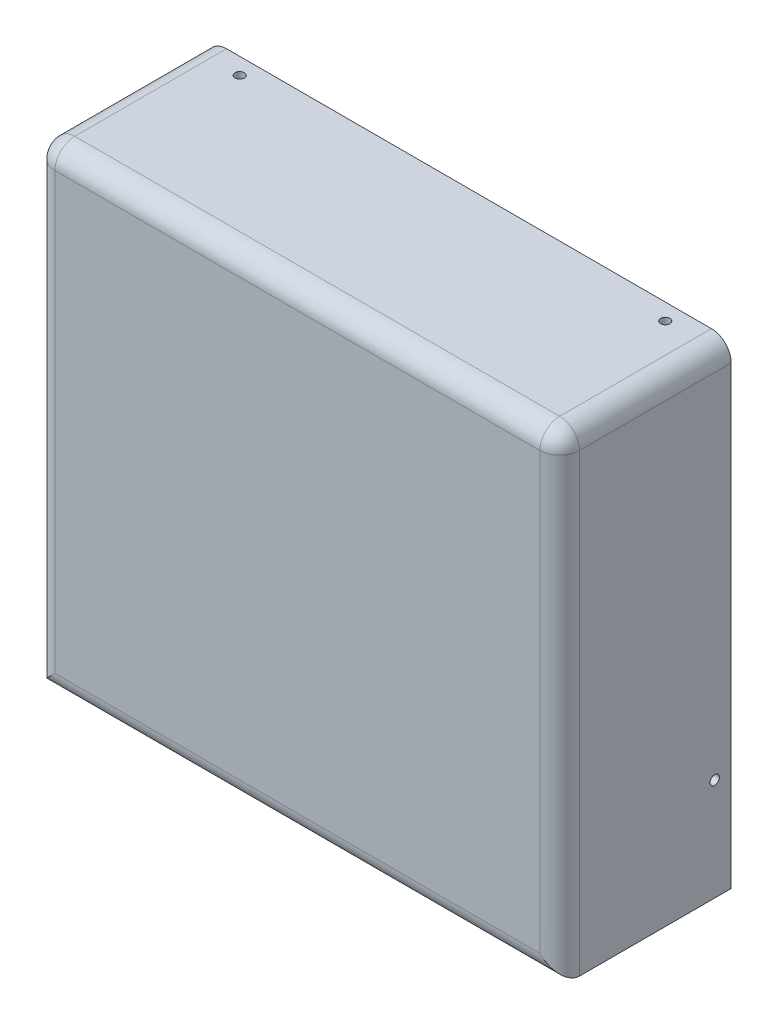
ISO-10303-21;
HEADER;
FILE_DESCRIPTION(('STEP AP214'),'2;1');
FILE_NAME('part.step','',(''),(''),'','','');
FILE_SCHEMA(('AUTOMOTIVE_DESIGN { 1 0 10303 214 1 1 1 1 }'));
ENDSEC;
DATA;
#1=APPLICATION_CONTEXT('core data for automotive mechanical design processes');
#2=APPLICATION_PROTOCOL_DEFINITION('international standard','automotive_design',2000,#1);
#3=PRODUCT_CONTEXT('',#1,'mechanical');
#4=PRODUCT('Part','Part','',(#3));
#5=PRODUCT_RELATED_PRODUCT_CATEGORY('part','',(#4));
#6=PRODUCT_DEFINITION_FORMATION('','',#4);
#7=PRODUCT_DEFINITION_CONTEXT('part definition',#1,'design');
#8=PRODUCT_DEFINITION('design','',#6,#7);
#9=PRODUCT_DEFINITION_SHAPE('','',#8);
#10=(LENGTH_UNIT() NAMED_UNIT(*) SI_UNIT(.MILLI.,.METRE.));
#11=(NAMED_UNIT(*) PLANE_ANGLE_UNIT() SI_UNIT($,.RADIAN.));
#12=(NAMED_UNIT(*) SI_UNIT($,.STERADIAN.) SOLID_ANGLE_UNIT());
#13=UNCERTAINTY_MEASURE_WITH_UNIT(LENGTH_MEASURE(1.E-05),#10,'distance_accuracy_value','');
#14=(GEOMETRIC_REPRESENTATION_CONTEXT(3) GLOBAL_UNCERTAINTY_ASSIGNED_CONTEXT((#13)) GLOBAL_UNIT_ASSIGNED_CONTEXT((#10,
#11,#12)) REPRESENTATION_CONTEXT('',''));
#15=CARTESIAN_POINT('',(0.,0.,0.));
#16=DIRECTION('',(0.,0.,1.));
#17=DIRECTION('',(1.,0.,0.));
#18=AXIS2_PLACEMENT_3D('',#15,#16,#17);
#19=CARTESIAN_POINT('',(0.,0.,63.5));
#20=DIRECTION('',(0.,-1.,0.));
#21=DIRECTION('',(0.,0.,-1.));
#22=AXIS2_PLACEMENT_3D('',#19,#20,#21);
#23=PLANE('',#22);
#24=CARTESIAN_POINT('',(16.51,0.,6.35));
#25=DIRECTION('',(0.,-1.,0.));
#26=DIRECTION('',(0.,0.,-1.));
#27=AXIS2_PLACEMENT_3D('',#24,#25,#26);
#28=CIRCLE('',#27,1.786001);
#29=CARTESIAN_POINT('',(16.51,0.,4.563999));
#30=VERTEX_POINT('',#29);
#31=EDGE_CURVE('E433',#30,#30,#28,.F.);
#32=ORIENTED_EDGE('',*,*,#31,.T.);
#33=EDGE_LOOP('',(#32));
#34=FACE_BOUND('',#33,.T.);
#35=DIRECTION('',(-1.,0.,0.));
#36=VECTOR('',#35,1.);
#37=CARTESIAN_POINT('',(0.,0.,0.));
#38=LINE('',#37,#36);
#39=CARTESIAN_POINT('',(191.77,0.,0.));
#40=VERTEX_POINT('',#39);
#41=CARTESIAN_POINT('',(5.08,0.,0.));
#42=VERTEX_POINT('',#41);
#43=EDGE_CURVE('E384',#40,#42,#38,.T.);
#44=ORIENTED_EDGE('',*,*,#43,.F.);
#45=DIRECTION('',(0.,0.,-1.));
#46=VECTOR('',#45,1.);
#47=CARTESIAN_POINT('',(191.77,0.,63.5));
#48=LINE('',#47,#46);
#49=CARTESIAN_POINT('',(191.77,0.,58.42));
#50=VERTEX_POINT('',#49);
#51=EDGE_CURVE('E361',#50,#40,#48,.T.);
#52=ORIENTED_EDGE('',*,*,#51,.F.);
#53=DIRECTION('',(-1.,0.,0.));
#54=VECTOR('',#53,1.);
#55=CARTESIAN_POINT('',(196.85,0.,58.42));
#56=LINE('',#55,#54);
#57=CARTESIAN_POINT('',(5.08,0.,58.42));
#58=VERTEX_POINT('',#57);
#59=EDGE_CURVE('E357',#58,#50,#56,.F.);
#60=ORIENTED_EDGE('',*,*,#59,.F.);
#61=DIRECTION('',(0.,0.,-1.));
#62=VECTOR('',#61,1.);
#63=CARTESIAN_POINT('',(5.08,0.,63.5));
#64=LINE('',#63,#62);
#65=EDGE_CURVE('E354',#42,#58,#64,.F.);
#66=ORIENTED_EDGE('',*,*,#65,.F.);
#67=EDGE_LOOP('',(#44,#52,#60,#66));
#68=FACE_BOUND('',#67,.T.);
#69=CARTESIAN_POINT('',(180.34,0.,6.35));
#70=DIRECTION('',(0.,-1.,0.));
#71=DIRECTION('',(0.,0.,-1.));
#72=AXIS2_PLACEMENT_3D('',#69,#70,#71);
#73=CIRCLE('',#72,1.78600100000001);
#74=CARTESIAN_POINT('',(180.34,0.,4.56399899999999));
#75=VERTEX_POINT('',#74);
#76=EDGE_CURVE('E416',#75,#75,#73,.F.);
#77=ORIENTED_EDGE('',*,*,#76,.T.);
#78=EDGE_LOOP('',(#77));
#79=FACE_BOUND('',#78,.T.);
#80=ADVANCED_FACE('F39',(#34,#68,#79),#23,.T.);
#81=CARTESIAN_POINT('',(-2.54,0.,63.5));
#82=DIRECTION('',(1.,0.,0.));
#83=DIRECTION('',(0.,1.,0.));
#84=AXIS2_PLACEMENT_3D('',#81,#82,#83);
#85=PLANE('',#84);
#86=CARTESIAN_POINT('',(-2.53999999999998,-140.97,6.35));
#87=DIRECTION('',(-1.,0.,0.));
#88=DIRECTION('',(0.,0.,1.));
#89=AXIS2_PLACEMENT_3D('',#86,#87,#88);
#90=CIRCLE('',#89,1.78600099999998);
#91=CARTESIAN_POINT('',(-2.53999999999998,-140.97,8.13600099999998));
#92=VERTEX_POINT('',#91);
#93=EDGE_CURVE('E449',#92,#92,#90,.T.);
#94=ORIENTED_EDGE('',*,*,#93,.F.);
#95=EDGE_LOOP('',(#94));
#96=FACE_BOUND('',#95,.T.);
#97=DIRECTION('',(0.,0.,-1.));
#98=VECTOR('',#97,1.);
#99=CARTESIAN_POINT('',(-2.53999999999998,-180.34,63.5));
#100=LINE('',#99,#98);
#101=CARTESIAN_POINT('',(-2.53999999999998,-180.34,58.42));
#102=VERTEX_POINT('',#101);
#103=CARTESIAN_POINT('',(-2.53999999999998,-180.34,0.));
#104=VERTEX_POINT('',#103);
#105=EDGE_CURVE('E219',#102,#104,#100,.T.);
#106=ORIENTED_EDGE('',*,*,#105,.F.);
#107=DIRECTION('',(0.,1.,0.));
#108=VECTOR('',#107,1.);
#109=CARTESIAN_POINT('',(-2.54,0.,58.42));
#110=LINE('',#109,#108);
#111=CARTESIAN_POINT('',(-2.54,-5.08,58.42));
#112=VERTEX_POINT('',#111);
#113=EDGE_CURVE('E66',#102,#112,#110,.T.);
#114=ORIENTED_EDGE('',*,*,#113,.T.);
#115=DIRECTION('',(0.,0.,1.));
#116=VECTOR('',#115,1.);
#117=CARTESIAN_POINT('',(-2.54,-5.08,63.5));
#118=LINE('',#117,#116);
#119=CARTESIAN_POINT('',(-2.54,-5.08,0.));
#120=VERTEX_POINT('',#119);
#121=EDGE_CURVE('E299',#112,#120,#118,.F.);
#122=ORIENTED_EDGE('',*,*,#121,.T.);
#123=DIRECTION('',(0.,-1.,0.));
#124=VECTOR('',#123,1.);
#125=CARTESIAN_POINT('',(-2.54,0.,0.));
#126=LINE('',#125,#124);
#127=EDGE_CURVE('E113',#120,#104,#126,.T.);
#128=ORIENTED_EDGE('',*,*,#127,.T.);
#129=EDGE_LOOP('',(#106,#114,#122,#128));
#130=FACE_BOUND('',#129,.T.);
#131=ADVANCED_FACE('F456',(#96,#130),#85,.F.);
#132=CARTESIAN_POINT('',(0.,-180.34,63.5));
#133=DIRECTION('',(0.,1.,0.));
#134=DIRECTION('',(0.,0.,1.));
#135=AXIS2_PLACEMENT_3D('',#132,#133,#134);
#136=PLANE('',#135);
#137=CARTESIAN_POINT('',(191.77,-180.34,11.7475));
#138=DIRECTION('',(0.,-1.,0.));
#139=DIRECTION('',(-1.,0.,0.));
#140=AXIS2_PLACEMENT_3D('',#137,#138,#139);
#141=CIRCLE('',#140,5.08);
#142=CARTESIAN_POINT('',(196.85,-180.34,11.7475));
#143=VERTEX_POINT('',#142);
#144=CARTESIAN_POINT('',(191.77,-180.34,16.8275));
#145=VERTEX_POINT('',#144);
#146=EDGE_CURVE('E415',#143,#145,#141,.T.);
#147=ORIENTED_EDGE('',*,*,#146,.F.);
#148=DIRECTION('',(0.,0.,1.));
#149=VECTOR('',#148,1.);
#150=CARTESIAN_POINT('',(196.85,-180.34,11.7475));
#151=LINE('',#150,#149);
#152=CARTESIAN_POINT('',(196.85,-180.34,0.));
#153=VERTEX_POINT('',#152);
#154=EDGE_CURVE('E412',#153,#143,#151,.T.);
#155=ORIENTED_EDGE('',*,*,#154,.F.);
#156=DIRECTION('',(1.,0.,0.));
#157=VECTOR('',#156,1.);
#158=CARTESIAN_POINT('',(0.,-180.34,0.));
#159=LINE('',#158,#157);
#160=CARTESIAN_POINT('',(199.39,-180.34,0.));
#161=VERTEX_POINT('',#160);
#162=EDGE_CURVE('E222',#153,#161,#159,.T.);
#163=ORIENTED_EDGE('',*,*,#162,.T.);
#164=DIRECTION('',(0.,0.,-1.));
#165=VECTOR('',#164,1.);
#166=CARTESIAN_POINT('',(199.39,-180.34,63.5));
#167=LINE('',#166,#165);
#168=CARTESIAN_POINT('',(199.39,-180.34,58.42));
#169=VERTEX_POINT('',#168);
#170=EDGE_CURVE('E233',#169,#161,#167,.T.);
#171=ORIENTED_EDGE('',*,*,#170,.F.);
#172=DIRECTION('',(1.,0.,0.));
#173=VECTOR('',#172,1.);
#174=CARTESIAN_POINT('',(0.,-180.34,58.42));
#175=LINE('',#174,#173);
#176=EDGE_CURVE('E294',#169,#102,#175,.F.);
#177=ORIENTED_EDGE('',*,*,#176,.T.);
#178=ORIENTED_EDGE('',*,*,#105,.T.);
#179=CARTESIAN_POINT('',(0.,-180.34,0.));
#180=VERTEX_POINT('',#179);
#181=EDGE_CURVE('E198',#104,#180,#159,.T.);
#182=ORIENTED_EDGE('',*,*,#181,.T.);
#183=DIRECTION('',(0.,0.,-1.));
#184=VECTOR('',#183,1.);
#185=CARTESIAN_POINT('',(0.,-180.34,0.));
#186=LINE('',#185,#184);
#187=CARTESIAN_POINT('',(0.,-180.34,11.7475));
#188=VERTEX_POINT('',#187);
#189=EDGE_CURVE('E207',#188,#180,#186,.T.);
#190=ORIENTED_EDGE('',*,*,#189,.F.);
#191=CARTESIAN_POINT('',(5.08,-180.34,11.7475));
#192=DIRECTION('',(0.,-1.,0.));
#193=DIRECTION('',(1.,0.,0.));
#194=AXIS2_PLACEMENT_3D('',#191,#192,#193);
#195=CIRCLE('',#194,5.08);
#196=CARTESIAN_POINT('',(5.08,-180.34,16.8275));
#197=VERTEX_POINT('',#196);
#198=EDGE_CURVE('E215',#197,#188,#195,.T.);
#199=ORIENTED_EDGE('',*,*,#198,.F.);
#200=DIRECTION('',(-1.,0.,0.));
#201=VECTOR('',#200,1.);
#202=CARTESIAN_POINT('',(5.08,-180.34,16.8275));
#203=LINE('',#202,#201);
#204=EDGE_CURVE('E420',#145,#197,#203,.T.);
#205=ORIENTED_EDGE('',*,*,#204,.F.);
#206=EDGE_LOOP('',(#147,#155,#163,#171,#177,#178,#182,#190,#199,#205));
#207=FACE_BOUND('',#206,.T.);
#208=ADVANCED_FACE('F218',(#207),#136,.F.);
#209=CARTESIAN_POINT('',(199.39,0.,63.5));
#210=DIRECTION('',(-1.,0.,0.));
#211=DIRECTION('',(0.,-1.,0.));
#212=AXIS2_PLACEMENT_3D('',#209,#210,#211);
#213=PLANE('',#212);
#214=CARTESIAN_POINT('',(199.39,-140.97,6.35));
#215=DIRECTION('',(-1.,0.,0.));
#216=DIRECTION('',(0.,0.,1.));
#217=AXIS2_PLACEMENT_3D('',#214,#215,#216);
#218=CIRCLE('',#217,1.78600099999995);
#219=CARTESIAN_POINT('',(199.39,-140.97,8.13600099999996));
#220=VERTEX_POINT('',#219);
#221=EDGE_CURVE('E445',#220,#220,#218,.T.);
#222=ORIENTED_EDGE('',*,*,#221,.T.);
#223=EDGE_LOOP('',(#222));
#224=FACE_BOUND('',#223,.T.);
#225=DIRECTION('',(0.,0.,1.));
#226=VECTOR('',#225,1.);
#227=CARTESIAN_POINT('',(199.39,-5.08,63.5));
#228=LINE('',#227,#226);
#229=CARTESIAN_POINT('',(199.39,-5.08,0.));
#230=VERTEX_POINT('',#229);
#231=CARTESIAN_POINT('',(199.39,-5.08,58.42));
#232=VERTEX_POINT('',#231);
#233=EDGE_CURVE('E261',#230,#232,#228,.T.);
#234=ORIENTED_EDGE('',*,*,#233,.T.);
#235=DIRECTION('',(0.,-1.,0.));
#236=VECTOR('',#235,1.);
#237=CARTESIAN_POINT('',(199.39,0.,58.42));
#238=LINE('',#237,#236);
#239=EDGE_CURVE('E291',#232,#169,#238,.T.);
#240=ORIENTED_EDGE('',*,*,#239,.T.);
#241=ORIENTED_EDGE('',*,*,#170,.T.);
#242=DIRECTION('',(0.,1.,0.));
#243=VECTOR('',#242,1.);
#244=CARTESIAN_POINT('',(199.39,0.,0.));
#245=LINE('',#244,#243);
#246=EDGE_CURVE('E221',#161,#230,#245,.T.);
#247=ORIENTED_EDGE('',*,*,#246,.T.);
#248=EDGE_LOOP('',(#234,#240,#241,#247));
#249=FACE_BOUND('',#248,.T.);
#250=ADVANCED_FACE('F493',(#224,#249),#213,.F.);
#251=CARTESIAN_POINT('',(0.,2.54,63.5));
#252=DIRECTION('',(0.,-1.,0.));
#253=DIRECTION('',(0.,0.,-1.));
#254=AXIS2_PLACEMENT_3D('',#251,#252,#253);
#255=PLANE('',#254);
#256=CARTESIAN_POINT('',(16.51,2.54,6.35));
#257=DIRECTION('',(0.,1.,0.));
#258=DIRECTION('',(0.,0.,1.));
#259=AXIS2_PLACEMENT_3D('',#256,#257,#258);
#260=CIRCLE('',#259,1.786001);
#261=CARTESIAN_POINT('',(16.51,2.54,8.136001));
#262=VERTEX_POINT('',#261);
#263=EDGE_CURVE('E437',#262,#262,#260,.T.);
#264=ORIENTED_EDGE('',*,*,#263,.F.);
#265=EDGE_LOOP('',(#264));
#266=FACE_BOUND('',#265,.T.);
#267=CARTESIAN_POINT('',(180.34,2.54,6.35));
#268=DIRECTION('',(0.,1.,0.));
#269=DIRECTION('',(0.,0.,1.));
#270=AXIS2_PLACEMENT_3D('',#267,#268,#269);
#271=CIRCLE('',#270,1.78600100000001);
#272=CARTESIAN_POINT('',(180.34,2.54,8.13600100000001));
#273=VERTEX_POINT('',#272);
#274=EDGE_CURVE('E429',#273,#273,#271,.T.);
#275=ORIENTED_EDGE('',*,*,#274,.F.);
#276=EDGE_LOOP('',(#275));
#277=FACE_BOUND('',#276,.T.);
#278=DIRECTION('',(-1.,0.,0.));
#279=VECTOR('',#278,1.);
#280=CARTESIAN_POINT('',(0.,2.54,0.));
#281=LINE('',#280,#279);
#282=CARTESIAN_POINT('',(191.77,2.54,0.));
#283=VERTEX_POINT('',#282);
#284=CARTESIAN_POINT('',(5.08,2.54,0.));
#285=VERTEX_POINT('',#284);
#286=EDGE_CURVE('E226',#283,#285,#281,.T.);
#287=ORIENTED_EDGE('',*,*,#286,.T.);
#288=DIRECTION('',(0.,0.,-1.));
#289=VECTOR('',#288,1.);
#290=CARTESIAN_POINT('',(5.08,2.54,63.5));
#291=LINE('',#290,#289);
#292=CARTESIAN_POINT('',(5.08,2.54,58.42));
#293=VERTEX_POINT('',#292);
#294=EDGE_CURVE('E257',#285,#293,#291,.F.);
#295=ORIENTED_EDGE('',*,*,#294,.T.);
#296=DIRECTION('',(1.,0.,0.));
#297=VECTOR('',#296,1.);
#298=CARTESIAN_POINT('',(0.,2.54,58.42));
#299=LINE('',#298,#297);
#300=CARTESIAN_POINT('',(191.77,2.54,58.42));
#301=VERTEX_POINT('',#300);
#302=EDGE_CURVE('E253',#293,#301,#299,.T.);
#303=ORIENTED_EDGE('',*,*,#302,.T.);
#304=DIRECTION('',(0.,0.,-1.));
#305=VECTOR('',#304,1.);
#306=CARTESIAN_POINT('',(191.77,2.54,63.5));
#307=LINE('',#306,#305);
#308=EDGE_CURVE('E258',#301,#283,#307,.T.);
#309=ORIENTED_EDGE('',*,*,#308,.T.);
#310=EDGE_LOOP('',(#287,#295,#303,#309));
#311=FACE_BOUND('',#310,.T.);
#312=ADVANCED_FACE('F482',(#266,#277,#311),#255,.F.);
#313=CARTESIAN_POINT('',(0.,0.,66.04));
#314=DIRECTION('',(0.,0.,1.));
#315=DIRECTION('',(1.,0.,0.));
#316=AXIS2_PLACEMENT_3D('',#313,#314,#315);
#317=PLANE('',#316);
#318=DIRECTION('',(0.,1.,0.));
#319=VECTOR('',#318,1.);
#320=CARTESIAN_POINT('',(191.77,0.,66.04));
#321=LINE('',#320,#319);
#322=CARTESIAN_POINT('',(191.77,-172.72,66.04));
#323=VERTEX_POINT('',#322);
#324=CARTESIAN_POINT('',(191.77,-5.08,66.04));
#325=VERTEX_POINT('',#324);
#326=EDGE_CURVE('E280',#323,#325,#321,.T.);
#327=ORIENTED_EDGE('',*,*,#326,.T.);
#328=DIRECTION('',(1.,0.,0.));
#329=VECTOR('',#328,1.);
#330=CARTESIAN_POINT('',(0.,-5.08,66.04));
#331=LINE('',#330,#329);
#332=CARTESIAN_POINT('',(5.08,-5.08,66.04));
#333=VERTEX_POINT('',#332);
#334=EDGE_CURVE('E269',#325,#333,#331,.F.);
#335=ORIENTED_EDGE('',*,*,#334,.T.);
#336=DIRECTION('',(0.,1.,0.));
#337=VECTOR('',#336,1.);
#338=CARTESIAN_POINT('',(5.08,0.,66.04));
#339=LINE('',#338,#337);
#340=CARTESIAN_POINT('',(5.08000000000002,-172.72,66.04));
#341=VERTEX_POINT('',#340);
#342=EDGE_CURVE('E273',#333,#341,#339,.F.);
#343=ORIENTED_EDGE('',*,*,#342,.T.);
#344=DIRECTION('',(1.,0.,0.));
#345=VECTOR('',#344,1.);
#346=CARTESIAN_POINT('',(0.,-172.72,66.04));
#347=LINE('',#346,#345);
#348=EDGE_CURVE('E276',#341,#323,#347,.T.);
#349=ORIENTED_EDGE('',*,*,#348,.T.);
#350=EDGE_LOOP('',(#327,#335,#343,#349));
#351=FACE_BOUND('',#350,.T.);
#352=ADVANCED_FACE('F500',(#351),#317,.T.);
#353=CARTESIAN_POINT('',(0.,0.,0.));
#354=DIRECTION('',(0.,0.,1.));
#355=DIRECTION('',(1.,0.,0.));
#356=AXIS2_PLACEMENT_3D('',#353,#354,#355);
#357=PLANE('',#356);
#358=ORIENTED_EDGE('',*,*,#162,.F.);
#359=DIRECTION('',(0.,1.,0.));
#360=VECTOR('',#359,1.);
#361=CARTESIAN_POINT('',(196.85,0.,0.));
#362=LINE('',#361,#360);
#363=CARTESIAN_POINT('',(196.85,-5.08,0.));
#364=VERTEX_POINT('',#363);
#365=EDGE_CURVE('E203',#153,#364,#362,.T.);
#366=ORIENTED_EDGE('',*,*,#365,.T.);
#367=CARTESIAN_POINT('',(191.77,-5.08,0.));
#368=DIRECTION('',(0.,0.,1.));
#369=DIRECTION('',(1.,0.,0.));
#370=AXIS2_PLACEMENT_3D('',#367,#368,#369);
#371=CIRCLE('',#370,5.08);
#372=EDGE_CURVE('E338',#40,#364,#371,.F.);
#373=ORIENTED_EDGE('',*,*,#372,.F.);
#374=ORIENTED_EDGE('',*,*,#43,.T.);
#375=CARTESIAN_POINT('',(5.08,-5.08,0.));
#376=DIRECTION('',(0.,0.,1.));
#377=DIRECTION('',(1.,0.,0.));
#378=AXIS2_PLACEMENT_3D('',#375,#376,#377);
#379=CIRCLE('',#378,5.08);
#380=CARTESIAN_POINT('',(0.,-5.08,0.));
#381=VERTEX_POINT('',#380);
#382=EDGE_CURVE('E200',#381,#42,#379,.F.);
#383=ORIENTED_EDGE('',*,*,#382,.F.);
#384=DIRECTION('',(0.,-1.,0.));
#385=VECTOR('',#384,1.);
#386=CARTESIAN_POINT('',(0.,0.,0.));
#387=LINE('',#386,#385);
#388=EDGE_CURVE('E193',#381,#180,#387,.T.);
#389=ORIENTED_EDGE('',*,*,#388,.T.);
#390=ORIENTED_EDGE('',*,*,#181,.F.);
#391=ORIENTED_EDGE('',*,*,#127,.F.);
#392=CARTESIAN_POINT('',(5.08,-5.08,0.));
#393=DIRECTION('',(0.,0.,1.));
#394=DIRECTION('',(1.,0.,0.));
#395=AXIS2_PLACEMENT_3D('',#392,#393,#394);
#396=CIRCLE('',#395,7.62);
#397=EDGE_CURVE('E11',#120,#285,#396,.F.);
#398=ORIENTED_EDGE('',*,*,#397,.T.);
#399=ORIENTED_EDGE('',*,*,#286,.F.);
#400=CARTESIAN_POINT('',(191.77,-5.08,0.));
#401=DIRECTION('',(0.,0.,1.));
#402=DIRECTION('',(1.,0.,0.));
#403=AXIS2_PLACEMENT_3D('',#400,#401,#402);
#404=CIRCLE('',#403,7.62);
#405=EDGE_CURVE('E49',#283,#230,#404,.F.);
#406=ORIENTED_EDGE('',*,*,#405,.T.);
#407=ORIENTED_EDGE('',*,*,#246,.F.);
#408=EDGE_LOOP('',(#358,#366,#373,#374,#383,#389,#390,#391,#398,#399,#406,#407));
#409=FACE_BOUND('',#408,.T.);
#410=ADVANCED_FACE('F196',(#409),#357,.F.);
#411=CARTESIAN_POINT('',(0.,-172.72,58.42));
#412=DIRECTION('',(-1.,0.,0.));
#413=DIRECTION('',(0.,0.,1.));
#414=AXIS2_PLACEMENT_3D('',#411,#412,#413);
#415=CYLINDRICAL_SURFACE('',#414,7.62);
#416=CARTESIAN_POINT('',(5.08000000000002,-172.72,58.42));
#417=DIRECTION('',(-0.707106781186548,0.707106781186547,0.));
#418=DIRECTION('',(0.707106781186547,0.707106781186548,0.));
#419=AXIS2_PLACEMENT_3D('',#416,#417,#418);
#420=ELLIPSE('',#419,10.776307345283,7.62);
#421=EDGE_CURVE('E266',#102,#341,#420,.T.);
#422=ORIENTED_EDGE('',*,*,#421,.F.);
#423=ORIENTED_EDGE('',*,*,#176,.F.);
#424=CARTESIAN_POINT('',(191.77,-172.72,58.42));
#425=DIRECTION('',(-0.707106781186547,-0.707106781186548,0.));
#426=DIRECTION('',(0.707106781186548,-0.707106781186547,0.));
#427=AXIS2_PLACEMENT_3D('',#424,#425,#426);
#428=ELLIPSE('',#427,10.776307345283,7.62);
#429=EDGE_CURVE('E237',#323,#169,#428,.F.);
#430=ORIENTED_EDGE('',*,*,#429,.F.);
#431=ORIENTED_EDGE('',*,*,#348,.F.);
#432=EDGE_LOOP('',(#422,#423,#430,#431));
#433=FACE_BOUND('',#432,.T.);
#434=ADVANCED_FACE('F463',(#433),#415,.T.);
#435=CARTESIAN_POINT('',(191.77,-5.08,63.5));
#436=DIRECTION('',(0.,0.,-1.));
#437=DIRECTION('',(-1.,0.,0.));
#438=AXIS2_PLACEMENT_3D('',#435,#436,#437);
#439=CYLINDRICAL_SURFACE('',#438,7.62);
#440=ORIENTED_EDGE('',*,*,#405,.F.);
#441=ORIENTED_EDGE('',*,*,#308,.F.);
#442=CARTESIAN_POINT('',(191.77,-5.08,58.42));
#443=DIRECTION('',(0.,0.,-1.));
#444=DIRECTION('',(-1.,0.,0.));
#445=AXIS2_PLACEMENT_3D('',#442,#443,#444);
#446=CIRCLE('',#445,7.62);
#447=EDGE_CURVE('E262',#232,#301,#446,.F.);
#448=ORIENTED_EDGE('',*,*,#447,.F.);
#449=ORIENTED_EDGE('',*,*,#233,.F.);
#450=EDGE_LOOP('',(#440,#441,#448,#449));
#451=FACE_BOUND('',#450,.T.);
#452=ADVANCED_FACE('F489',(#451),#439,.T.);
#453=CARTESIAN_POINT('',(191.77,0.,58.42));
#454=DIRECTION('',(0.,-1.,0.));
#455=DIRECTION('',(1.,0.,0.));
#456=AXIS2_PLACEMENT_3D('',#453,#454,#455);
#457=CYLINDRICAL_SURFACE('',#456,7.62);
#458=ORIENTED_EDGE('',*,*,#429,.T.);
#459=ORIENTED_EDGE('',*,*,#239,.F.);
#460=CARTESIAN_POINT('',(191.77,-5.08,58.42));
#461=DIRECTION('',(0.,1.,0.));
#462=DIRECTION('',(-1.,0.,0.));
#463=AXIS2_PLACEMENT_3D('',#460,#461,#462);
#464=CIRCLE('',#463,7.62);
#465=EDGE_CURVE('E249',#325,#232,#464,.T.);
#466=ORIENTED_EDGE('',*,*,#465,.F.);
#467=ORIENTED_EDGE('',*,*,#326,.F.);
#468=EDGE_LOOP('',(#458,#459,#466,#467));
#469=FACE_BOUND('',#468,.T.);
#470=ADVANCED_FACE('F497',(#469),#457,.T.);
#471=CARTESIAN_POINT('',(5.08,0.,58.42));
#472=DIRECTION('',(0.,1.,0.));
#473=DIRECTION('',(-1.,0.,0.));
#474=AXIS2_PLACEMENT_3D('',#471,#472,#473);
#475=CYLINDRICAL_SURFACE('',#474,7.62);
#476=ORIENTED_EDGE('',*,*,#421,.T.);
#477=ORIENTED_EDGE('',*,*,#342,.F.);
#478=CARTESIAN_POINT('',(5.08,-5.08,58.42));
#479=DIRECTION('',(0.,-1.,0.));
#480=DIRECTION('',(1.,0.,0.));
#481=AXIS2_PLACEMENT_3D('',#478,#479,#480);
#482=CIRCLE('',#481,7.62);
#483=EDGE_CURVE('E245',#112,#333,#482,.F.);
#484=ORIENTED_EDGE('',*,*,#483,.F.);
#485=ORIENTED_EDGE('',*,*,#113,.F.);
#486=EDGE_LOOP('',(#476,#477,#484,#485));
#487=FACE_BOUND('',#486,.T.);
#488=ADVANCED_FACE('F468',(#487),#475,.T.);
#489=CARTESIAN_POINT('',(5.08,-5.08,63.5));
#490=DIRECTION('',(0.,0.,-1.));
#491=DIRECTION('',(-1.,0.,0.));
#492=AXIS2_PLACEMENT_3D('',#489,#490,#491);
#493=CYLINDRICAL_SURFACE('',#492,7.62);
#494=ORIENTED_EDGE('',*,*,#397,.F.);
#495=ORIENTED_EDGE('',*,*,#121,.F.);
#496=CARTESIAN_POINT('',(5.08,-5.08,58.42));
#497=DIRECTION('',(0.,0.,1.));
#498=DIRECTION('',(0.,-1.,0.));
#499=AXIS2_PLACEMENT_3D('',#496,#497,#498);
#500=CIRCLE('',#499,7.62);
#501=EDGE_CURVE('E241',#293,#112,#500,.T.);
#502=ORIENTED_EDGE('',*,*,#501,.F.);
#503=ORIENTED_EDGE('',*,*,#294,.F.);
#504=EDGE_LOOP('',(#494,#495,#502,#503));
#505=FACE_BOUND('',#504,.T.);
#506=ADVANCED_FACE('F477',(#505),#493,.T.);
#507=CARTESIAN_POINT('',(191.77,-5.08,58.42));
#508=DIRECTION('',(1.,0.,0.));
#509=DIRECTION('',(0.,1.,0.));
#510=AXIS2_PLACEMENT_3D('',#507,#508,#509);
#511=SPHERICAL_SURFACE('',#510,7.62);
#512=ORIENTED_EDGE('',*,*,#465,.T.);
#513=ORIENTED_EDGE('',*,*,#447,.T.);
#514=CARTESIAN_POINT('',(191.77,-5.08,58.42));
#515=DIRECTION('',(1.,0.,0.));
#516=DIRECTION('',(0.,0.,-1.));
#517=AXIS2_PLACEMENT_3D('',#514,#515,#516);
#518=CIRCLE('',#517,7.62);
#519=EDGE_CURVE('E238',#325,#301,#518,.F.);
#520=ORIENTED_EDGE('',*,*,#519,.F.);
#521=EDGE_LOOP('',(#512,#513,#520));
#522=FACE_BOUND('',#521,.T.);
#523=ADVANCED_FACE('F787',(#522),#511,.T.);
#524=CARTESIAN_POINT('',(5.08,-5.08,58.42));
#525=DIRECTION('',(-1.,0.,0.));
#526=DIRECTION('',(0.,-1.,0.));
#527=AXIS2_PLACEMENT_3D('',#524,#525,#526);
#528=SPHERICAL_SURFACE('',#527,7.62);
#529=ORIENTED_EDGE('',*,*,#501,.T.);
#530=ORIENTED_EDGE('',*,*,#483,.T.);
#531=CARTESIAN_POINT('',(5.08,-5.08,58.42));
#532=DIRECTION('',(1.,0.,0.));
#533=DIRECTION('',(0.,0.,-1.));
#534=AXIS2_PLACEMENT_3D('',#531,#532,#533);
#535=CIRCLE('',#534,7.62);
#536=EDGE_CURVE('E242',#293,#333,#535,.T.);
#537=ORIENTED_EDGE('',*,*,#536,.F.);
#538=EDGE_LOOP('',(#529,#530,#537));
#539=FACE_BOUND('',#538,.T.);
#540=ADVANCED_FACE('F472',(#539),#528,.T.);
#541=CARTESIAN_POINT('',(0.,-5.08,58.42));
#542=DIRECTION('',(1.,0.,0.));
#543=DIRECTION('',(0.,0.,-1.));
#544=AXIS2_PLACEMENT_3D('',#541,#542,#543);
#545=CYLINDRICAL_SURFACE('',#544,7.62);
#546=ORIENTED_EDGE('',*,*,#519,.T.);
#547=ORIENTED_EDGE('',*,*,#302,.F.);
#548=ORIENTED_EDGE('',*,*,#536,.T.);
#549=ORIENTED_EDGE('',*,*,#334,.F.);
#550=EDGE_LOOP('',(#546,#547,#548,#549));
#551=FACE_BOUND('',#550,.T.);
#552=ADVANCED_FACE('F41',(#551),#545,.T.);
#553=CARTESIAN_POINT('',(0.,0.,63.5));
#554=DIRECTION('',(1.,0.,0.));
#555=DIRECTION('',(0.,1.,0.));
#556=AXIS2_PLACEMENT_3D('',#553,#554,#555);
#557=PLANE('',#556);
#558=CARTESIAN_POINT('',(0.,-140.97,6.35));
#559=DIRECTION('',(1.,0.,0.));
#560=DIRECTION('',(0.,1.,0.));
#561=AXIS2_PLACEMENT_3D('',#558,#559,#560);
#562=CIRCLE('',#561,1.78600099999997);
#563=CARTESIAN_POINT('',(0.,-139.183999,6.35));
#564=VERTEX_POINT('',#563);
#565=EDGE_CURVE('E43',#564,#564,#562,.T.);
#566=ORIENTED_EDGE('',*,*,#565,.F.);
#567=EDGE_LOOP('',(#566));
#568=FACE_BOUND('',#567,.T.);
#569=DIRECTION('',(0.,0.,-1.));
#570=VECTOR('',#569,1.);
#571=CARTESIAN_POINT('',(0.,-177.8,63.5));
#572=LINE('',#571,#570);
#573=CARTESIAN_POINT('',(0.,-177.8,58.42));
#574=VERTEX_POINT('',#573);
#575=CARTESIAN_POINT('',(0.,-177.8,11.7475));
#576=VERTEX_POINT('',#575);
#577=EDGE_CURVE('E377',#574,#576,#572,.T.);
#578=ORIENTED_EDGE('',*,*,#577,.T.);
#579=DIRECTION('',(0.,-1.,0.));
#580=VECTOR('',#579,1.);
#581=CARTESIAN_POINT('',(0.,19.7679307383918,11.7475));
#582=LINE('',#581,#580);
#583=EDGE_CURVE('E210',#576,#188,#582,.T.);
#584=ORIENTED_EDGE('',*,*,#583,.T.);
#585=ORIENTED_EDGE('',*,*,#189,.T.);
#586=ORIENTED_EDGE('',*,*,#388,.F.);
#587=DIRECTION('',(0.,0.,-1.));
#588=VECTOR('',#587,1.);
#589=CARTESIAN_POINT('',(0.,-5.08,63.5));
#590=LINE('',#589,#588);
#591=CARTESIAN_POINT('',(0.,-5.08,58.42));
#592=VERTEX_POINT('',#591);
#593=EDGE_CURVE('E128',#592,#381,#590,.T.);
#594=ORIENTED_EDGE('',*,*,#593,.F.);
#595=DIRECTION('',(0.,-1.,0.));
#596=VECTOR('',#595,1.);
#597=CARTESIAN_POINT('',(0.,0.,58.42));
#598=LINE('',#597,#596);
#599=EDGE_CURVE('E121',#574,#592,#598,.F.);
#600=ORIENTED_EDGE('',*,*,#599,.F.);
#601=EDGE_LOOP('',(#578,#584,#585,#586,#594,#600));
#602=FACE_BOUND('',#601,.T.);
#603=ADVANCED_FACE('F209',(#568,#602),#557,.T.);
#604=CARTESIAN_POINT('',(0.,-177.8,63.5));
#605=DIRECTION('',(0.,1.,0.));
#606=DIRECTION('',(0.,0.,1.));
#607=AXIS2_PLACEMENT_3D('',#604,#605,#606);
#608=PLANE('',#607);
#609=CARTESIAN_POINT('',(191.77,-177.8,11.7475));
#610=DIRECTION('',(0.,1.,0.));
#611=DIRECTION('',(0.,0.,1.));
#612=AXIS2_PLACEMENT_3D('',#609,#610,#611);
#613=CIRCLE('',#612,5.08);
#614=CARTESIAN_POINT('',(196.85,-177.8,11.7475));
#615=VERTEX_POINT('',#614);
#616=CARTESIAN_POINT('',(191.77,-177.8,16.8275));
#617=VERTEX_POINT('',#616);
#618=EDGE_CURVE('E392',#615,#617,#613,.F.);
#619=ORIENTED_EDGE('',*,*,#618,.T.);
#620=DIRECTION('',(-1.,0.,0.));
#621=VECTOR('',#620,1.);
#622=CARTESIAN_POINT('',(5.07999999999997,-177.8,16.8275));
#623=LINE('',#622,#621);
#624=CARTESIAN_POINT('',(5.07999999999997,-177.8,16.8275));
#625=VERTEX_POINT('',#624);
#626=EDGE_CURVE('E396',#617,#625,#623,.T.);
#627=ORIENTED_EDGE('',*,*,#626,.T.);
#628=CARTESIAN_POINT('',(5.08,-177.8,11.7475));
#629=DIRECTION('',(0.,1.,0.));
#630=DIRECTION('',(0.,0.,1.));
#631=AXIS2_PLACEMENT_3D('',#628,#629,#630);
#632=CIRCLE('',#631,5.08);
#633=EDGE_CURVE('E400',#625,#576,#632,.F.);
#634=ORIENTED_EDGE('',*,*,#633,.T.);
#635=ORIENTED_EDGE('',*,*,#577,.F.);
#636=DIRECTION('',(1.,0.,0.));
#637=VECTOR('',#636,1.);
#638=CARTESIAN_POINT('',(0.,-177.8,58.42));
#639=LINE('',#638,#637);
#640=CARTESIAN_POINT('',(196.85,-177.8,58.42));
#641=VERTEX_POINT('',#640);
#642=EDGE_CURVE('E345',#641,#574,#639,.F.);
#643=ORIENTED_EDGE('',*,*,#642,.F.);
#644=DIRECTION('',(0.,0.,-1.));
#645=VECTOR('',#644,1.);
#646=CARTESIAN_POINT('',(196.85,-177.8,63.5));
#647=LINE('',#646,#645);
#648=EDGE_CURVE('E380',#641,#615,#647,.T.);
#649=ORIENTED_EDGE('',*,*,#648,.T.);
#650=EDGE_LOOP('',(#619,#627,#634,#635,#643,#649));
#651=FACE_BOUND('',#650,.T.);
#652=ADVANCED_FACE('F524',(#651),#608,.T.);
#653=CARTESIAN_POINT('',(196.85,0.,63.5));
#654=DIRECTION('',(-1.,0.,0.));
#655=DIRECTION('',(0.,-1.,0.));
#656=AXIS2_PLACEMENT_3D('',#653,#654,#655);
#657=PLANE('',#656);
#658=CARTESIAN_POINT('',(196.85,-140.97,6.35));
#659=DIRECTION('',(-1.,0.,0.));
#660=DIRECTION('',(0.,-1.,0.));
#661=AXIS2_PLACEMENT_3D('',#658,#659,#660);
#662=CIRCLE('',#661,1.78600099999997);
#663=CARTESIAN_POINT('',(196.85,-142.756001,6.35));
#664=VERTEX_POINT('',#663);
#665=EDGE_CURVE('E441',#664,#664,#662,.T.);
#666=ORIENTED_EDGE('',*,*,#665,.F.);
#667=EDGE_LOOP('',(#666));
#668=FACE_BOUND('',#667,.T.);
#669=DIRECTION('',(0.,0.,-1.));
#670=VECTOR('',#669,1.);
#671=CARTESIAN_POINT('',(196.85,-5.08,63.5));
#672=LINE('',#671,#670);
#673=CARTESIAN_POINT('',(196.85,-5.08,58.42));
#674=VERTEX_POINT('',#673);
#675=EDGE_CURVE('E351',#364,#674,#672,.F.);
#676=ORIENTED_EDGE('',*,*,#675,.F.);
#677=ORIENTED_EDGE('',*,*,#365,.F.);
#678=ORIENTED_EDGE('',*,*,#154,.T.);
#679=DIRECTION('',(0.,-1.,0.));
#680=VECTOR('',#679,1.);
#681=CARTESIAN_POINT('',(196.85,19.7679307383919,11.7475));
#682=LINE('',#681,#680);
#683=EDGE_CURVE('E57',#615,#143,#682,.T.);
#684=ORIENTED_EDGE('',*,*,#683,.F.);
#685=ORIENTED_EDGE('',*,*,#648,.F.);
#686=DIRECTION('',(0.,1.,0.));
#687=VECTOR('',#686,1.);
#688=CARTESIAN_POINT('',(196.85,-177.8,58.42));
#689=LINE('',#688,#687);
#690=EDGE_CURVE('E348',#674,#641,#689,.F.);
#691=ORIENTED_EDGE('',*,*,#690,.F.);
#692=EDGE_LOOP('',(#676,#677,#678,#684,#685,#691));
#693=FACE_BOUND('',#692,.T.);
#694=ADVANCED_FACE('F521',(#668,#693),#657,.T.);
#695=CARTESIAN_POINT('',(0.,0.,63.5));
#696=DIRECTION('',(0.,0.,1.));
#697=DIRECTION('',(1.,0.,0.));
#698=AXIS2_PLACEMENT_3D('',#695,#696,#697);
#699=PLANE('',#698);
#700=DIRECTION('',(0.,1.,0.));
#701=VECTOR('',#700,1.);
#702=CARTESIAN_POINT('',(191.77,0.,63.5));
#703=LINE('',#702,#701);
#704=CARTESIAN_POINT('',(191.77,-172.72,63.5));
#705=VERTEX_POINT('',#704);
#706=CARTESIAN_POINT('',(191.77,-5.08,63.5));
#707=VERTEX_POINT('',#706);
#708=EDGE_CURVE('E368',#705,#707,#703,.T.);
#709=ORIENTED_EDGE('',*,*,#708,.F.);
#710=DIRECTION('',(1.,0.,0.));
#711=VECTOR('',#710,1.);
#712=CARTESIAN_POINT('',(196.85,-172.72,63.5));
#713=LINE('',#712,#711);
#714=CARTESIAN_POINT('',(5.08000000000002,-172.72,63.5));
#715=VERTEX_POINT('',#714);
#716=EDGE_CURVE('E371',#715,#705,#713,.T.);
#717=ORIENTED_EDGE('',*,*,#716,.F.);
#718=DIRECTION('',(0.,-1.,0.));
#719=VECTOR('',#718,1.);
#720=CARTESIAN_POINT('',(5.08000000000002,-177.8,63.5));
#721=LINE('',#720,#719);
#722=CARTESIAN_POINT('',(5.08,-5.08,63.5));
#723=VERTEX_POINT('',#722);
#724=EDGE_CURVE('E374',#723,#715,#721,.T.);
#725=ORIENTED_EDGE('',*,*,#724,.F.);
#726=DIRECTION('',(-1.,0.,0.));
#727=VECTOR('',#726,1.);
#728=CARTESIAN_POINT('',(0.,-5.08,63.5));
#729=LINE('',#728,#727);
#730=EDGE_CURVE('E364',#707,#723,#729,.T.);
#731=ORIENTED_EDGE('',*,*,#730,.F.);
#732=EDGE_LOOP('',(#709,#717,#725,#731));
#733=FACE_BOUND('',#732,.T.);
#734=ADVANCED_FACE('F519',(#733),#699,.F.);
#735=CARTESIAN_POINT('',(0.,-172.72,58.42));
#736=DIRECTION('',(-1.,0.,0.));
#737=DIRECTION('',(0.,0.,1.));
#738=AXIS2_PLACEMENT_3D('',#735,#736,#737);
#739=CYLINDRICAL_SURFACE('',#738,5.08);
#740=CARTESIAN_POINT('',(5.08000000000002,-172.72,58.42));
#741=DIRECTION('',(-0.707106781186548,0.707106781186547,0.));
#742=DIRECTION('',(0.707106781186547,0.707106781186548,0.));
#743=AXIS2_PLACEMENT_3D('',#740,#741,#742);
#744=ELLIPSE('',#743,7.18420489685532,5.08);
#745=EDGE_CURVE('E312',#574,#715,#744,.T.);
#746=ORIENTED_EDGE('',*,*,#745,.T.);
#747=ORIENTED_EDGE('',*,*,#716,.T.);
#748=CARTESIAN_POINT('',(191.77,-172.72,58.42));
#749=DIRECTION('',(-0.707106781186547,-0.707106781186548,0.));
#750=DIRECTION('',(-0.707106781186548,0.707106781186547,0.));
#751=AXIS2_PLACEMENT_3D('',#748,#749,#750);
#752=ELLIPSE('',#751,7.18420489685532,5.08);
#753=EDGE_CURVE('E204',#705,#641,#752,.F.);
#754=ORIENTED_EDGE('',*,*,#753,.T.);
#755=ORIENTED_EDGE('',*,*,#642,.T.);
#756=EDGE_LOOP('',(#746,#747,#754,#755));
#757=FACE_BOUND('',#756,.T.);
#758=ADVANCED_FACE('F558',(#757),#739,.F.);
#759=CARTESIAN_POINT('',(191.77,-5.08,63.5));
#760=DIRECTION('',(0.,0.,-1.));
#761=DIRECTION('',(-1.,0.,0.));
#762=AXIS2_PLACEMENT_3D('',#759,#760,#761);
#763=CYLINDRICAL_SURFACE('',#762,5.08);
#764=ORIENTED_EDGE('',*,*,#372,.T.);
#765=ORIENTED_EDGE('',*,*,#675,.T.);
#766=CARTESIAN_POINT('',(191.77,-5.08,58.42));
#767=DIRECTION('',(0.,0.,1.));
#768=DIRECTION('',(1.,0.,0.));
#769=AXIS2_PLACEMENT_3D('',#766,#767,#768);
#770=CIRCLE('',#769,5.08);
#771=EDGE_CURVE('E316',#674,#50,#770,.T.);
#772=ORIENTED_EDGE('',*,*,#771,.T.);
#773=ORIENTED_EDGE('',*,*,#51,.T.);
#774=EDGE_LOOP('',(#764,#765,#772,#773));
#775=FACE_BOUND('',#774,.T.);
#776=ADVANCED_FACE('F554',(#775),#763,.F.);
#777=CARTESIAN_POINT('',(191.77,0.,58.42));
#778=DIRECTION('',(0.,-1.,0.));
#779=DIRECTION('',(1.,0.,0.));
#780=AXIS2_PLACEMENT_3D('',#777,#778,#779);
#781=CYLINDRICAL_SURFACE('',#780,5.08);
#782=ORIENTED_EDGE('',*,*,#753,.F.);
#783=ORIENTED_EDGE('',*,*,#708,.T.);
#784=CARTESIAN_POINT('',(191.77,-5.08,58.42));
#785=DIRECTION('',(0.,1.,0.));
#786=DIRECTION('',(-1.,0.,0.));
#787=AXIS2_PLACEMENT_3D('',#784,#785,#786);
#788=CIRCLE('',#787,5.08);
#789=EDGE_CURVE('E320',#707,#674,#788,.T.);
#790=ORIENTED_EDGE('',*,*,#789,.T.);
#791=ORIENTED_EDGE('',*,*,#690,.T.);
#792=EDGE_LOOP('',(#782,#783,#790,#791));
#793=FACE_BOUND('',#792,.T.);
#794=ADVANCED_FACE('F551',(#793),#781,.F.);
#795=CARTESIAN_POINT('',(5.08,0.,58.42));
#796=DIRECTION('',(0.,1.,0.));
#797=DIRECTION('',(-1.,0.,0.));
#798=AXIS2_PLACEMENT_3D('',#795,#796,#797);
#799=CYLINDRICAL_SURFACE('',#798,5.08);
#800=ORIENTED_EDGE('',*,*,#745,.F.);
#801=ORIENTED_EDGE('',*,*,#599,.T.);
#802=CARTESIAN_POINT('',(5.08,-5.08,58.42));
#803=DIRECTION('',(0.,1.,0.));
#804=DIRECTION('',(-1.,0.,0.));
#805=AXIS2_PLACEMENT_3D('',#802,#803,#804);
#806=CIRCLE('',#805,5.08);
#807=EDGE_CURVE('E324',#592,#723,#806,.T.);
#808=ORIENTED_EDGE('',*,*,#807,.T.);
#809=ORIENTED_EDGE('',*,*,#724,.T.);
#810=EDGE_LOOP('',(#800,#801,#808,#809));
#811=FACE_BOUND('',#810,.T.);
#812=ADVANCED_FACE('F548',(#811),#799,.F.);
#813=CARTESIAN_POINT('',(5.08,-5.08,63.5));
#814=DIRECTION('',(0.,0.,-1.));
#815=DIRECTION('',(-1.,0.,0.));
#816=AXIS2_PLACEMENT_3D('',#813,#814,#815);
#817=CYLINDRICAL_SURFACE('',#816,5.08);
#818=ORIENTED_EDGE('',*,*,#382,.T.);
#819=ORIENTED_EDGE('',*,*,#65,.T.);
#820=CARTESIAN_POINT('',(5.08,-5.08,58.42));
#821=DIRECTION('',(0.,0.,1.));
#822=DIRECTION('',(1.,0.,0.));
#823=AXIS2_PLACEMENT_3D('',#820,#821,#822);
#824=CIRCLE('',#823,5.08);
#825=EDGE_CURVE('E327',#58,#592,#824,.T.);
#826=ORIENTED_EDGE('',*,*,#825,.T.);
#827=ORIENTED_EDGE('',*,*,#593,.T.);
#828=EDGE_LOOP('',(#818,#819,#826,#827));
#829=FACE_BOUND('',#828,.T.);
#830=ADVANCED_FACE('F544',(#829),#817,.F.);
#831=CARTESIAN_POINT('',(191.77,-5.08,58.42));
#832=DIRECTION('',(1.,0.,0.));
#833=DIRECTION('',(0.,1.,0.));
#834=AXIS2_PLACEMENT_3D('',#831,#832,#833);
#835=SPHERICAL_SURFACE('',#834,5.08);
#836=ORIENTED_EDGE('',*,*,#789,.F.);
#837=CARTESIAN_POINT('',(191.77,-5.08,58.42));
#838=DIRECTION('',(1.,0.,0.));
#839=DIRECTION('',(0.,0.,-1.));
#840=AXIS2_PLACEMENT_3D('',#837,#838,#839);
#841=CIRCLE('',#840,5.08);
#842=EDGE_CURVE('E330',#707,#50,#841,.F.);
#843=ORIENTED_EDGE('',*,*,#842,.T.);
#844=ORIENTED_EDGE('',*,*,#771,.F.);
#845=EDGE_LOOP('',(#836,#843,#844));
#846=FACE_BOUND('',#845,.T.);
#847=ADVANCED_FACE('F540',(#846),#835,.F.);
#848=CARTESIAN_POINT('',(5.08,-5.08,58.42));
#849=DIRECTION('',(-1.,0.,0.));
#850=DIRECTION('',(0.,-1.,0.));
#851=AXIS2_PLACEMENT_3D('',#848,#849,#850);
#852=SPHERICAL_SURFACE('',#851,5.08);
#853=ORIENTED_EDGE('',*,*,#825,.F.);
#854=CARTESIAN_POINT('',(5.08,-5.08,58.42));
#855=DIRECTION('',(-1.,0.,0.));
#856=DIRECTION('',(0.,0.,1.));
#857=AXIS2_PLACEMENT_3D('',#854,#855,#856);
#858=CIRCLE('',#857,5.08);
#859=EDGE_CURVE('E333',#58,#723,#858,.F.);
#860=ORIENTED_EDGE('',*,*,#859,.T.);
#861=ORIENTED_EDGE('',*,*,#807,.F.);
#862=EDGE_LOOP('',(#853,#860,#861));
#863=FACE_BOUND('',#862,.T.);
#864=ADVANCED_FACE('F536',(#863),#852,.F.);
#865=CARTESIAN_POINT('',(0.,-5.08,58.42));
#866=DIRECTION('',(1.,0.,0.));
#867=DIRECTION('',(0.,0.,-1.));
#868=AXIS2_PLACEMENT_3D('',#865,#866,#867);
#869=CYLINDRICAL_SURFACE('',#868,5.08);
#870=ORIENTED_EDGE('',*,*,#842,.F.);
#871=ORIENTED_EDGE('',*,*,#730,.T.);
#872=ORIENTED_EDGE('',*,*,#859,.F.);
#873=ORIENTED_EDGE('',*,*,#59,.T.);
#874=EDGE_LOOP('',(#870,#871,#872,#873));
#875=FACE_BOUND('',#874,.T.);
#876=ADVANCED_FACE('F532',(#875),#869,.F.);
#877=CARTESIAN_POINT('',(191.77,19.7679307383919,11.7475));
#878=DIRECTION('',(0.,-1.,0.));
#879=DIRECTION('',(1.,0.,0.));
#880=AXIS2_PLACEMENT_3D('',#877,#878,#879);
#881=CYLINDRICAL_SURFACE('',#880,5.08);
#882=ORIENTED_EDGE('',*,*,#683,.T.);
#883=ORIENTED_EDGE('',*,*,#146,.T.);
#884=DIRECTION('',(0.,-1.,0.));
#885=VECTOR('',#884,1.);
#886=CARTESIAN_POINT('',(191.77,19.7679307383919,16.8275));
#887=LINE('',#886,#885);
#888=EDGE_CURVE('E393',#617,#145,#887,.T.);
#889=ORIENTED_EDGE('',*,*,#888,.F.);
#890=ORIENTED_EDGE('',*,*,#618,.F.);
#891=EDGE_LOOP('',(#882,#883,#889,#890));
#892=FACE_BOUND('',#891,.T.);
#893=ADVANCED_FACE('F535',(#892),#881,.F.);
#894=CARTESIAN_POINT('',(5.07999999999997,19.7679307383918,16.8275));
#895=DIRECTION('',(0.,0.,1.));
#896=DIRECTION('',(1.,0.,0.));
#897=AXIS2_PLACEMENT_3D('',#894,#895,#896);
#898=PLANE('',#897);
#899=ORIENTED_EDGE('',*,*,#888,.T.);
#900=ORIENTED_EDGE('',*,*,#204,.T.);
#901=DIRECTION('',(0.,-1.,0.));
#902=VECTOR('',#901,1.);
#903=CARTESIAN_POINT('',(5.07999999999997,19.7679307383918,16.8275));
#904=LINE('',#903,#902);
#905=EDGE_CURVE('E397',#625,#197,#904,.T.);
#906=ORIENTED_EDGE('',*,*,#905,.F.);
#907=ORIENTED_EDGE('',*,*,#626,.F.);
#908=EDGE_LOOP('',(#899,#900,#906,#907));
#909=FACE_BOUND('',#908,.T.);
#910=ADVANCED_FACE('F591',(#909),#898,.F.);
#911=CARTESIAN_POINT('',(5.07999999999997,19.7679307383918,11.7475));
#912=DIRECTION('',(0.,-1.,0.));
#913=DIRECTION('',(1.,0.,0.));
#914=AXIS2_PLACEMENT_3D('',#911,#912,#913);
#915=CYLINDRICAL_SURFACE('',#914,5.08);
#916=ORIENTED_EDGE('',*,*,#905,.T.);
#917=ORIENTED_EDGE('',*,*,#198,.T.);
#918=ORIENTED_EDGE('',*,*,#583,.F.);
#919=ORIENTED_EDGE('',*,*,#633,.F.);
#920=EDGE_LOOP('',(#916,#917,#918,#919));
#921=FACE_BOUND('',#920,.T.);
#922=ADVANCED_FACE('F587',(#921),#915,.F.);
#923=CARTESIAN_POINT('',(180.34,2.54,6.35));
#924=DIRECTION('',(0.,1.,0.));
#925=DIRECTION('',(0.,0.,1.));
#926=AXIS2_PLACEMENT_3D('',#923,#924,#925);
#927=CYLINDRICAL_SURFACE('',#926,1.78600100000001);
#928=ORIENTED_EDGE('',*,*,#76,.F.);
#929=EDGE_LOOP('',(#928));
#930=FACE_BOUND('',#929,.T.);
#931=ORIENTED_EDGE('',*,*,#274,.T.);
#932=EDGE_LOOP('',(#931));
#933=FACE_BOUND('',#932,.T.);
#934=ADVANCED_FACE('F583',(#930,#933),#927,.F.);
#935=CARTESIAN_POINT('',(16.51,2.54,6.35));
#936=DIRECTION('',(0.,1.,0.));
#937=DIRECTION('',(0.,0.,1.));
#938=AXIS2_PLACEMENT_3D('',#935,#936,#937);
#939=CYLINDRICAL_SURFACE('',#938,1.786001);
#940=ORIENTED_EDGE('',*,*,#31,.F.);
#941=EDGE_LOOP('',(#940));
#942=FACE_BOUND('',#941,.T.);
#943=ORIENTED_EDGE('',*,*,#263,.T.);
#944=EDGE_LOOP('',(#943));
#945=FACE_BOUND('',#944,.T.);
#946=ADVANCED_FACE('F578',(#942,#945),#939,.F.);
#947=CARTESIAN_POINT('',(-2.53999999999998,-140.97,6.35));
#948=DIRECTION('',(-1.,0.,0.));
#949=DIRECTION('',(0.,0.,1.));
#950=AXIS2_PLACEMENT_3D('',#947,#948,#949);
#951=CYLINDRICAL_SURFACE('',#950,1.78600099999997);
#952=ORIENTED_EDGE('',*,*,#565,.T.);
#953=EDGE_LOOP('',(#952));
#954=FACE_BOUND('',#953,.T.);
#955=ORIENTED_EDGE('',*,*,#93,.T.);
#956=EDGE_LOOP('',(#955));
#957=FACE_BOUND('',#956,.T.);
#958=ADVANCED_FACE('F454',(#954,#957),#951,.F.);
#959=ORIENTED_EDGE('',*,*,#665,.T.);
#960=EDGE_LOOP('',(#959));
#961=FACE_BOUND('',#960,.T.);
#962=ORIENTED_EDGE('',*,*,#221,.F.);
#963=EDGE_LOOP('',(#962));
#964=FACE_BOUND('',#963,.T.);
#965=ADVANCED_FACE('F571',(#961,#964),#951,.F.);
#966=CLOSED_SHELL('',(#80,#131,#208,#250,#312,#352,#410,#434,#452,#470,#488,#506,#523,#540,#552,
#603,#652,#694,#734,#758,#776,#794,#812,#830,#847,#864,#876,#893,#910,#922,#934,#946,#958,#965));
#967=MANIFOLD_SOLID_BREP('B2',#966);
#968=ADVANCED_BREP_SHAPE_REPRESENTATION('',(#18,#967),#14);
#969=SHAPE_DEFINITION_REPRESENTATION(#9,#968);
ENDSEC;
END-ISO-10303-21;
